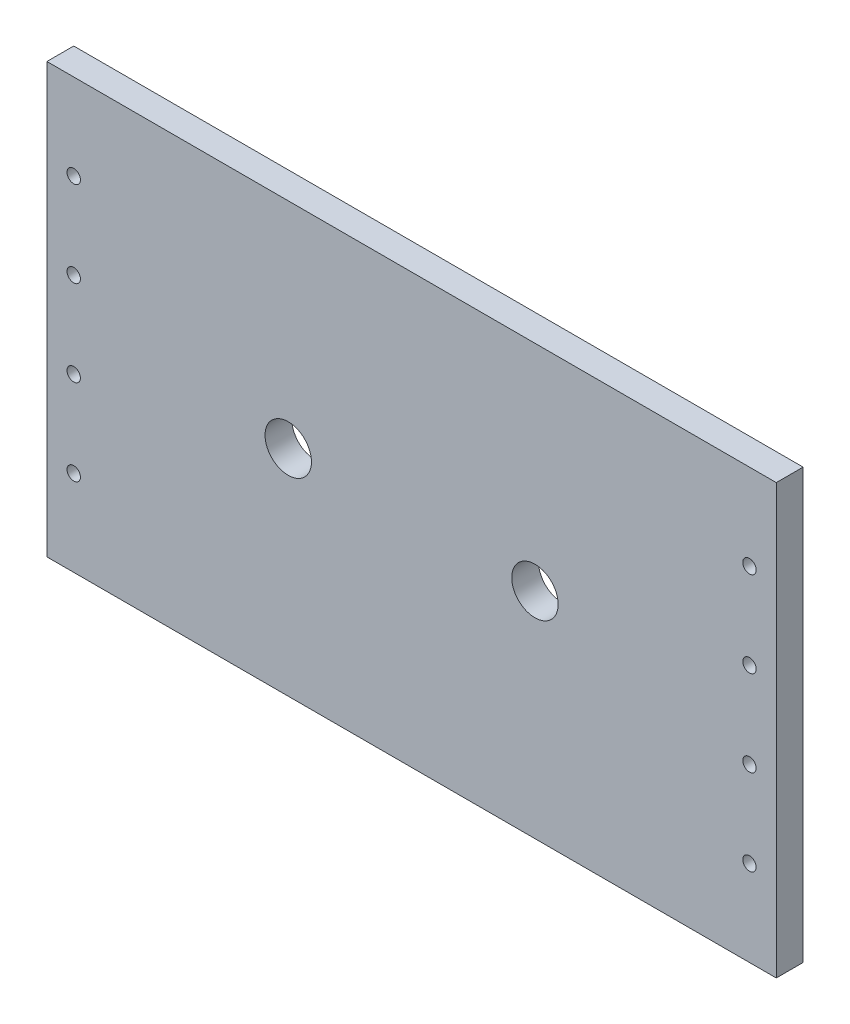
ISO-10303-21;
HEADER;
FILE_DESCRIPTION(('STEP AP214'),'2;1');
FILE_NAME('part.step','',(''),(''),'','','');
FILE_SCHEMA(('AUTOMOTIVE_DESIGN { 1 0 10303 214 1 1 1 1 }'));
ENDSEC;
DATA;
#1=APPLICATION_CONTEXT('core data for automotive mechanical design processes');
#2=APPLICATION_PROTOCOL_DEFINITION('international standard','automotive_design',2000,#1);
#3=PRODUCT_CONTEXT('',#1,'mechanical');
#4=PRODUCT('Part','Part','',(#3));
#5=PRODUCT_RELATED_PRODUCT_CATEGORY('part','',(#4));
#6=PRODUCT_DEFINITION_FORMATION('','',#4);
#7=PRODUCT_DEFINITION_CONTEXT('part definition',#1,'design');
#8=PRODUCT_DEFINITION('design','',#6,#7);
#9=PRODUCT_DEFINITION_SHAPE('','',#8);
#10=(LENGTH_UNIT() NAMED_UNIT(*) SI_UNIT(.MILLI.,.METRE.));
#11=(NAMED_UNIT(*) PLANE_ANGLE_UNIT() SI_UNIT($,.RADIAN.));
#12=(NAMED_UNIT(*) SI_UNIT($,.STERADIAN.) SOLID_ANGLE_UNIT());
#13=UNCERTAINTY_MEASURE_WITH_UNIT(LENGTH_MEASURE(1.E-05),#10,'distance_accuracy_value','');
#14=(GEOMETRIC_REPRESENTATION_CONTEXT(3) GLOBAL_UNCERTAINTY_ASSIGNED_CONTEXT((#13)) GLOBAL_UNIT_ASSIGNED_CONTEXT((#10,
#11,#12)) REPRESENTATION_CONTEXT('',''));
#15=CARTESIAN_POINT('',(0.,0.,0.));
#16=DIRECTION('',(0.,0.,1.));
#17=DIRECTION('',(1.,0.,0.));
#18=AXIS2_PLACEMENT_3D('',#15,#16,#17);
#19=CARTESIAN_POINT('',(0.,0.,6.35));
#20=DIRECTION('',(1.,0.,0.));
#21=DIRECTION('',(0.,0.,-1.));
#22=AXIS2_PLACEMENT_3D('',#19,#20,#21);
#23=PLANE('',#22);
#24=DIRECTION('',(0.,-1.,0.));
#25=VECTOR('',#24,1.);
#26=CARTESIAN_POINT('',(0.,0.,0.));
#27=LINE('',#26,#25);
#28=CARTESIAN_POINT('',(0.,101.6,0.));
#29=VERTEX_POINT('',#28);
#30=CARTESIAN_POINT('',(0.,0.,0.));
#31=VERTEX_POINT('',#30);
#32=EDGE_CURVE('E107',#29,#31,#27,.T.);
#33=ORIENTED_EDGE('',*,*,#32,.T.);
#34=DIRECTION('',(0.,0.,-1.));
#35=VECTOR('',#34,1.);
#36=CARTESIAN_POINT('',(0.,0.,6.35));
#37=LINE('',#36,#35);
#38=CARTESIAN_POINT('',(0.,0.,6.35));
#39=VERTEX_POINT('',#38);
#40=EDGE_CURVE('E11',#39,#31,#37,.T.);
#41=ORIENTED_EDGE('',*,*,#40,.F.);
#42=DIRECTION('',(0.,-1.,0.));
#43=VECTOR('',#42,1.);
#44=CARTESIAN_POINT('',(0.,0.,6.35));
#45=LINE('',#44,#43);
#46=CARTESIAN_POINT('',(0.,101.6,6.35));
#47=VERTEX_POINT('',#46);
#48=EDGE_CURVE('E91',#47,#39,#45,.T.);
#49=ORIENTED_EDGE('',*,*,#48,.F.);
#50=DIRECTION('',(0.,0.,-1.));
#51=VECTOR('',#50,1.);
#52=CARTESIAN_POINT('',(0.,101.6,6.35));
#53=LINE('',#52,#51);
#54=EDGE_CURVE('E103',#47,#29,#53,.T.);
#55=ORIENTED_EDGE('',*,*,#54,.T.);
#56=EDGE_LOOP('',(#33,#41,#49,#55));
#57=FACE_BOUND('',#56,.T.);
#58=ADVANCED_FACE('F39',(#57),#23,.F.);
#59=CARTESIAN_POINT('',(0.,0.,6.35));
#60=DIRECTION('',(0.,1.,0.));
#61=DIRECTION('',(0.,0.,1.));
#62=AXIS2_PLACEMENT_3D('',#59,#60,#61);
#63=PLANE('',#62);
#64=DIRECTION('',(1.,0.,0.));
#65=VECTOR('',#64,1.);
#66=CARTESIAN_POINT('',(0.,0.,0.));
#67=LINE('',#66,#65);
#68=CARTESIAN_POINT('',(172.72,0.,0.));
#69=VERTEX_POINT('',#68);
#70=EDGE_CURVE('E96',#31,#69,#67,.T.);
#71=ORIENTED_EDGE('',*,*,#70,.T.);
#72=DIRECTION('',(0.,0.,-1.));
#73=VECTOR('',#72,1.);
#74=CARTESIAN_POINT('',(172.72,0.,6.35));
#75=LINE('',#74,#73);
#76=CARTESIAN_POINT('',(172.72,0.,6.35));
#77=VERTEX_POINT('',#76);
#78=EDGE_CURVE('E48',#77,#69,#75,.T.);
#79=ORIENTED_EDGE('',*,*,#78,.F.);
#80=DIRECTION('',(1.,0.,0.));
#81=VECTOR('',#80,1.);
#82=CARTESIAN_POINT('',(0.,0.,6.35));
#83=LINE('',#82,#81);
#84=EDGE_CURVE('E86',#39,#77,#83,.T.);
#85=ORIENTED_EDGE('',*,*,#84,.F.);
#86=ORIENTED_EDGE('',*,*,#40,.T.);
#87=EDGE_LOOP('',(#71,#79,#85,#86));
#88=FACE_BOUND('',#87,.T.);
#89=ADVANCED_FACE('F95',(#88),#63,.F.);
#90=CARTESIAN_POINT('',(172.72,0.,6.35));
#91=DIRECTION('',(-1.,0.,0.));
#92=DIRECTION('',(0.,0.,1.));
#93=AXIS2_PLACEMENT_3D('',#90,#91,#92);
#94=PLANE('',#93);
#95=DIRECTION('',(0.,1.,0.));
#96=VECTOR('',#95,1.);
#97=CARTESIAN_POINT('',(172.72,0.,0.));
#98=LINE('',#97,#96);
#99=CARTESIAN_POINT('',(172.72,101.6,0.));
#100=VERTEX_POINT('',#99);
#101=EDGE_CURVE('E73',#69,#100,#98,.T.);
#102=ORIENTED_EDGE('',*,*,#101,.T.);
#103=DIRECTION('',(0.,0.,-1.));
#104=VECTOR('',#103,1.);
#105=CARTESIAN_POINT('',(172.72,101.6,6.35));
#106=LINE('',#105,#104);
#107=CARTESIAN_POINT('',(172.72,101.6,6.35));
#108=VERTEX_POINT('',#107);
#109=EDGE_CURVE('E98',#108,#100,#106,.T.);
#110=ORIENTED_EDGE('',*,*,#109,.F.);
#111=DIRECTION('',(0.,1.,0.));
#112=VECTOR('',#111,1.);
#113=CARTESIAN_POINT('',(172.72,0.,6.35));
#114=LINE('',#113,#112);
#115=EDGE_CURVE('E89',#77,#108,#114,.T.);
#116=ORIENTED_EDGE('',*,*,#115,.F.);
#117=ORIENTED_EDGE('',*,*,#78,.T.);
#118=EDGE_LOOP('',(#102,#110,#116,#117));
#119=FACE_BOUND('',#118,.T.);
#120=ADVANCED_FACE('F99',(#119),#94,.F.);
#121=CARTESIAN_POINT('',(0.,101.6,6.35));
#122=DIRECTION('',(0.,-1.,0.));
#123=DIRECTION('',(0.,0.,-1.));
#124=AXIS2_PLACEMENT_3D('',#121,#122,#123);
#125=PLANE('',#124);
#126=DIRECTION('',(-1.,0.,0.));
#127=VECTOR('',#126,1.);
#128=CARTESIAN_POINT('',(0.,101.6,0.));
#129=LINE('',#128,#127);
#130=EDGE_CURVE('E79',#100,#29,#129,.T.);
#131=ORIENTED_EDGE('',*,*,#130,.T.);
#132=ORIENTED_EDGE('',*,*,#54,.F.);
#133=DIRECTION('',(-1.,0.,0.));
#134=VECTOR('',#133,1.);
#135=CARTESIAN_POINT('',(0.,101.6,6.35));
#136=LINE('',#135,#134);
#137=EDGE_CURVE('E56',#108,#47,#136,.T.);
#138=ORIENTED_EDGE('',*,*,#137,.F.);
#139=ORIENTED_EDGE('',*,*,#109,.T.);
#140=EDGE_LOOP('',(#131,#132,#138,#139));
#141=FACE_BOUND('',#140,.T.);
#142=ADVANCED_FACE('F121',(#141),#125,.F.);
#143=CARTESIAN_POINT('',(0.,0.,6.35));
#144=DIRECTION('',(0.,0.,-1.));
#145=DIRECTION('',(-1.,0.,0.));
#146=AXIS2_PLACEMENT_3D('',#143,#144,#145);
#147=PLANE('',#146);
#148=CARTESIAN_POINT('',(115.57,50.8,6.35));
#149=DIRECTION('',(0.,0.,1.));
#150=DIRECTION('',(1.,0.,0.));
#151=AXIS2_PLACEMENT_3D('',#148,#149,#150);
#152=CIRCLE('',#151,5.49926131403117);
#153=CARTESIAN_POINT('',(121.069261314031,50.8,6.35));
#154=VERTEX_POINT('',#153);
#155=EDGE_CURVE('E200',#154,#154,#152,.T.);
#156=ORIENTED_EDGE('',*,*,#155,.F.);
#157=EDGE_LOOP('',(#156));
#158=FACE_BOUND('',#157,.T.);
#159=CARTESIAN_POINT('',(57.15,50.8,6.35));
#160=DIRECTION('',(0.,0.,1.));
#161=DIRECTION('',(1.,0.,0.));
#162=AXIS2_PLACEMENT_3D('',#159,#160,#161);
#163=CIRCLE('',#162,5.49926131403118);
#164=CARTESIAN_POINT('',(62.6492613140312,50.8,6.35));
#165=VERTEX_POINT('',#164);
#166=EDGE_CURVE('E192',#165,#165,#163,.T.);
#167=ORIENTED_EDGE('',*,*,#166,.F.);
#168=EDGE_LOOP('',(#167));
#169=FACE_BOUND('',#168,.T.);
#170=CARTESIAN_POINT('',(6.34999999999999,60.96,6.35));
#171=DIRECTION('',(0.,0.,1.));
#172=DIRECTION('',(1.,0.,0.));
#173=AXIS2_PLACEMENT_3D('',#170,#171,#172);
#174=CIRCLE('',#173,1.5875);
#175=CARTESIAN_POINT('',(7.9375,60.96,6.35));
#176=VERTEX_POINT('',#175);
#177=EDGE_CURVE('E161',#176,#176,#174,.T.);
#178=ORIENTED_EDGE('',*,*,#177,.F.);
#179=EDGE_LOOP('',(#178));
#180=FACE_BOUND('',#179,.T.);
#181=CARTESIAN_POINT('',(6.34999999999999,40.64,6.35));
#182=DIRECTION('',(0.,0.,1.));
#183=DIRECTION('',(1.,0.,0.));
#184=AXIS2_PLACEMENT_3D('',#181,#182,#183);
#185=CIRCLE('',#184,1.5875);
#186=CARTESIAN_POINT('',(7.93749999999999,40.64,6.35));
#187=VERTEX_POINT('',#186);
#188=EDGE_CURVE('E153',#187,#187,#185,.T.);
#189=ORIENTED_EDGE('',*,*,#188,.F.);
#190=EDGE_LOOP('',(#189));
#191=FACE_BOUND('',#190,.T.);
#192=CARTESIAN_POINT('',(6.34999999999999,20.32,6.35));
#193=DIRECTION('',(0.,0.,1.));
#194=DIRECTION('',(1.,0.,0.));
#195=AXIS2_PLACEMENT_3D('',#192,#193,#194);
#196=CIRCLE('',#195,1.5875);
#197=CARTESIAN_POINT('',(7.93749999999999,20.32,6.35));
#198=VERTEX_POINT('',#197);
#199=EDGE_CURVE('E145',#198,#198,#196,.T.);
#200=ORIENTED_EDGE('',*,*,#199,.F.);
#201=EDGE_LOOP('',(#200));
#202=FACE_BOUND('',#201,.T.);
#203=CARTESIAN_POINT('',(166.37,20.32,6.35));
#204=DIRECTION('',(0.,0.,1.));
#205=DIRECTION('',(1.,0.,0.));
#206=AXIS2_PLACEMENT_3D('',#203,#204,#205);
#207=CIRCLE('',#206,1.58749999999999);
#208=CARTESIAN_POINT('',(167.9575,20.32,6.35));
#209=VERTEX_POINT('',#208);
#210=EDGE_CURVE('E136',#209,#209,#207,.T.);
#211=ORIENTED_EDGE('',*,*,#210,.F.);
#212=EDGE_LOOP('',(#211));
#213=FACE_BOUND('',#212,.T.);
#214=CARTESIAN_POINT('',(166.37,40.64,6.35));
#215=DIRECTION('',(0.,0.,1.));
#216=DIRECTION('',(1.,0.,0.));
#217=AXIS2_PLACEMENT_3D('',#214,#215,#216);
#218=CIRCLE('',#217,1.58749999999999);
#219=CARTESIAN_POINT('',(167.9575,40.64,6.35));
#220=VERTEX_POINT('',#219);
#221=EDGE_CURVE('E185',#220,#220,#218,.T.);
#222=ORIENTED_EDGE('',*,*,#221,.F.);
#223=EDGE_LOOP('',(#222));
#224=FACE_BOUND('',#223,.T.);
#225=CARTESIAN_POINT('',(166.37,60.96,6.35));
#226=DIRECTION('',(0.,0.,1.));
#227=DIRECTION('',(1.,0.,0.));
#228=AXIS2_PLACEMENT_3D('',#225,#226,#227);
#229=CIRCLE('',#228,1.58749999999999);
#230=CARTESIAN_POINT('',(167.9575,60.96,6.35));
#231=VERTEX_POINT('',#230);
#232=EDGE_CURVE('E177',#231,#231,#229,.T.);
#233=ORIENTED_EDGE('',*,*,#232,.F.);
#234=EDGE_LOOP('',(#233));
#235=FACE_BOUND('',#234,.T.);
#236=CARTESIAN_POINT('',(166.37,81.28,6.35));
#237=DIRECTION('',(0.,0.,1.));
#238=DIRECTION('',(1.,0.,0.));
#239=AXIS2_PLACEMENT_3D('',#236,#237,#238);
#240=CIRCLE('',#239,1.58749999999999);
#241=CARTESIAN_POINT('',(167.9575,81.28,6.35));
#242=VERTEX_POINT('',#241);
#243=EDGE_CURVE('E168',#242,#242,#240,.T.);
#244=ORIENTED_EDGE('',*,*,#243,.F.);
#245=EDGE_LOOP('',(#244));
#246=FACE_BOUND('',#245,.T.);
#247=CARTESIAN_POINT('',(6.34999999999999,81.28,6.35));
#248=DIRECTION('',(0.,0.,1.));
#249=DIRECTION('',(1.,0.,0.));
#250=AXIS2_PLACEMENT_3D('',#247,#248,#249);
#251=CIRCLE('',#250,1.5875);
#252=CARTESIAN_POINT('',(7.93749999999999,81.28,6.35));
#253=VERTEX_POINT('',#252);
#254=EDGE_CURVE('E128',#253,#253,#251,.T.);
#255=ORIENTED_EDGE('',*,*,#254,.F.);
#256=EDGE_LOOP('',(#255));
#257=FACE_BOUND('',#256,.T.);
#258=ORIENTED_EDGE('',*,*,#48,.T.);
#259=ORIENTED_EDGE('',*,*,#84,.T.);
#260=ORIENTED_EDGE('',*,*,#115,.T.);
#261=ORIENTED_EDGE('',*,*,#137,.T.);
#262=EDGE_LOOP('',(#258,#259,#260,#261));
#263=FACE_BOUND('',#262,.T.);
#264=ADVANCED_FACE('F87',(#158,#169,#180,#191,#202,#213,#224,#235,#246,#257,#263),#147,.F.);
#265=CARTESIAN_POINT('',(0.,0.,0.));
#266=DIRECTION('',(0.,0.,-1.));
#267=DIRECTION('',(-1.,0.,0.));
#268=AXIS2_PLACEMENT_3D('',#265,#266,#267);
#269=PLANE('',#268);
#270=CARTESIAN_POINT('',(115.57,50.8,0.));
#271=DIRECTION('',(0.,0.,1.));
#272=DIRECTION('',(1.,0.,0.));
#273=AXIS2_PLACEMENT_3D('',#270,#271,#272);
#274=CIRCLE('',#273,5.49926131403117);
#275=CARTESIAN_POINT('',(121.069261314031,50.8,0.));
#276=VERTEX_POINT('',#275);
#277=EDGE_CURVE('E173',#276,#276,#274,.T.);
#278=ORIENTED_EDGE('',*,*,#277,.T.);
#279=EDGE_LOOP('',(#278));
#280=FACE_BOUND('',#279,.T.);
#281=CARTESIAN_POINT('',(57.15,50.8,0.));
#282=DIRECTION('',(0.,0.,1.));
#283=DIRECTION('',(1.,0.,0.));
#284=AXIS2_PLACEMENT_3D('',#281,#282,#283);
#285=CIRCLE('',#284,5.49926131403118);
#286=CARTESIAN_POINT('',(62.6492613140312,50.8,0.));
#287=VERTEX_POINT('',#286);
#288=EDGE_CURVE('E196',#287,#287,#285,.T.);
#289=ORIENTED_EDGE('',*,*,#288,.T.);
#290=EDGE_LOOP('',(#289));
#291=FACE_BOUND('',#290,.T.);
#292=CARTESIAN_POINT('',(6.34999999999999,60.96,0.));
#293=DIRECTION('',(0.,0.,1.));
#294=DIRECTION('',(1.,0.,0.));
#295=AXIS2_PLACEMENT_3D('',#292,#293,#294);
#296=CIRCLE('',#295,1.5875);
#297=CARTESIAN_POINT('',(7.9375,60.96,0.));
#298=VERTEX_POINT('',#297);
#299=EDGE_CURVE('E132',#298,#298,#296,.T.);
#300=ORIENTED_EDGE('',*,*,#299,.T.);
#301=EDGE_LOOP('',(#300));
#302=FACE_BOUND('',#301,.T.);
#303=CARTESIAN_POINT('',(6.34999999999999,40.64,0.));
#304=DIRECTION('',(0.,0.,1.));
#305=DIRECTION('',(1.,0.,0.));
#306=AXIS2_PLACEMENT_3D('',#303,#304,#305);
#307=CIRCLE('',#306,1.5875);
#308=CARTESIAN_POINT('',(7.93749999999999,40.64,0.));
#309=VERTEX_POINT('',#308);
#310=EDGE_CURVE('E157',#309,#309,#307,.T.);
#311=ORIENTED_EDGE('',*,*,#310,.T.);
#312=EDGE_LOOP('',(#311));
#313=FACE_BOUND('',#312,.T.);
#314=CARTESIAN_POINT('',(6.34999999999999,20.32,0.));
#315=DIRECTION('',(0.,0.,1.));
#316=DIRECTION('',(1.,0.,0.));
#317=AXIS2_PLACEMENT_3D('',#314,#315,#316);
#318=CIRCLE('',#317,1.5875);
#319=CARTESIAN_POINT('',(7.93749999999999,20.32,0.));
#320=VERTEX_POINT('',#319);
#321=EDGE_CURVE('E149',#320,#320,#318,.T.);
#322=ORIENTED_EDGE('',*,*,#321,.T.);
#323=EDGE_LOOP('',(#322));
#324=FACE_BOUND('',#323,.T.);
#325=CARTESIAN_POINT('',(166.37,20.32,0.));
#326=DIRECTION('',(0.,0.,1.));
#327=DIRECTION('',(1.,0.,0.));
#328=AXIS2_PLACEMENT_3D('',#325,#326,#327);
#329=CIRCLE('',#328,1.58749999999999);
#330=CARTESIAN_POINT('',(167.9575,20.32,0.));
#331=VERTEX_POINT('',#330);
#332=EDGE_CURVE('E140',#331,#331,#329,.T.);
#333=ORIENTED_EDGE('',*,*,#332,.T.);
#334=EDGE_LOOP('',(#333));
#335=FACE_BOUND('',#334,.T.);
#336=CARTESIAN_POINT('',(166.37,40.64,0.));
#337=DIRECTION('',(0.,0.,1.));
#338=DIRECTION('',(1.,0.,0.));
#339=AXIS2_PLACEMENT_3D('',#336,#337,#338);
#340=CIRCLE('',#339,1.58749999999999);
#341=CARTESIAN_POINT('',(167.9575,40.64,0.));
#342=VERTEX_POINT('',#341);
#343=EDGE_CURVE('E141',#342,#342,#340,.T.);
#344=ORIENTED_EDGE('',*,*,#343,.T.);
#345=EDGE_LOOP('',(#344));
#346=FACE_BOUND('',#345,.T.);
#347=CARTESIAN_POINT('',(166.37,60.96,0.));
#348=DIRECTION('',(0.,0.,1.));
#349=DIRECTION('',(1.,0.,0.));
#350=AXIS2_PLACEMENT_3D('',#347,#348,#349);
#351=CIRCLE('',#350,1.58749999999999);
#352=CARTESIAN_POINT('',(167.9575,60.96,0.));
#353=VERTEX_POINT('',#352);
#354=EDGE_CURVE('E181',#353,#353,#351,.T.);
#355=ORIENTED_EDGE('',*,*,#354,.T.);
#356=EDGE_LOOP('',(#355));
#357=FACE_BOUND('',#356,.T.);
#358=CARTESIAN_POINT('',(166.37,81.28,0.));
#359=DIRECTION('',(0.,0.,1.));
#360=DIRECTION('',(1.,0.,0.));
#361=AXIS2_PLACEMENT_3D('',#358,#359,#360);
#362=CIRCLE('',#361,1.58749999999999);
#363=CARTESIAN_POINT('',(167.9575,81.28,0.));
#364=VERTEX_POINT('',#363);
#365=EDGE_CURVE('E172',#364,#364,#362,.T.);
#366=ORIENTED_EDGE('',*,*,#365,.T.);
#367=EDGE_LOOP('',(#366));
#368=FACE_BOUND('',#367,.T.);
#369=CARTESIAN_POINT('',(6.34999999999999,81.28,0.));
#370=DIRECTION('',(0.,0.,1.));
#371=DIRECTION('',(1.,0.,0.));
#372=AXIS2_PLACEMENT_3D('',#369,#370,#371);
#373=CIRCLE('',#372,1.5875);
#374=CARTESIAN_POINT('',(7.93749999999999,81.28,0.));
#375=VERTEX_POINT('',#374);
#376=EDGE_CURVE('E111',#375,#375,#373,.T.);
#377=ORIENTED_EDGE('',*,*,#376,.T.);
#378=EDGE_LOOP('',(#377));
#379=FACE_BOUND('',#378,.T.);
#380=ORIENTED_EDGE('',*,*,#32,.F.);
#381=ORIENTED_EDGE('',*,*,#130,.F.);
#382=ORIENTED_EDGE('',*,*,#101,.F.);
#383=ORIENTED_EDGE('',*,*,#70,.F.);
#384=EDGE_LOOP('',(#380,#381,#382,#383));
#385=FACE_BOUND('',#384,.T.);
#386=ADVANCED_FACE('F124',(#280,#291,#302,#313,#324,#335,#346,#357,#368,#379,#385),#269,.T.);
#387=CARTESIAN_POINT('',(6.34999999999999,81.28,0.));
#388=DIRECTION('',(0.,0.,1.));
#389=DIRECTION('',(1.,0.,0.));
#390=AXIS2_PLACEMENT_3D('',#387,#388,#389);
#391=CYLINDRICAL_SURFACE('',#390,1.5875);
#392=ORIENTED_EDGE('',*,*,#376,.F.);
#393=EDGE_LOOP('',(#392));
#394=FACE_BOUND('',#393,.T.);
#395=ORIENTED_EDGE('',*,*,#254,.T.);
#396=EDGE_LOOP('',(#395));
#397=FACE_BOUND('',#396,.T.);
#398=ADVANCED_FACE('F238',(#394,#397),#391,.F.);
#399=CARTESIAN_POINT('',(166.37,81.28,0.));
#400=DIRECTION('',(0.,0.,1.));
#401=DIRECTION('',(1.,0.,0.));
#402=AXIS2_PLACEMENT_3D('',#399,#400,#401);
#403=CYLINDRICAL_SURFACE('',#402,1.58749999999999);
#404=ORIENTED_EDGE('',*,*,#365,.F.);
#405=EDGE_LOOP('',(#404));
#406=FACE_BOUND('',#405,.T.);
#407=ORIENTED_EDGE('',*,*,#243,.T.);
#408=EDGE_LOOP('',(#407));
#409=FACE_BOUND('',#408,.T.);
#410=ADVANCED_FACE('F240',(#406,#409),#403,.F.);
#411=CARTESIAN_POINT('',(166.37,60.96,0.));
#412=DIRECTION('',(0.,0.,1.));
#413=DIRECTION('',(1.,0.,0.));
#414=AXIS2_PLACEMENT_3D('',#411,#412,#413);
#415=CYLINDRICAL_SURFACE('',#414,1.58749999999999);
#416=ORIENTED_EDGE('',*,*,#354,.F.);
#417=EDGE_LOOP('',(#416));
#418=FACE_BOUND('',#417,.T.);
#419=ORIENTED_EDGE('',*,*,#232,.T.);
#420=EDGE_LOOP('',(#419));
#421=FACE_BOUND('',#420,.T.);
#422=ADVANCED_FACE('F247',(#418,#421),#415,.F.);
#423=CARTESIAN_POINT('',(166.37,40.64,0.));
#424=DIRECTION('',(0.,0.,1.));
#425=DIRECTION('',(1.,0.,0.));
#426=AXIS2_PLACEMENT_3D('',#423,#424,#425);
#427=CYLINDRICAL_SURFACE('',#426,1.58749999999999);
#428=ORIENTED_EDGE('',*,*,#343,.F.);
#429=EDGE_LOOP('',(#428));
#430=FACE_BOUND('',#429,.T.);
#431=ORIENTED_EDGE('',*,*,#221,.T.);
#432=EDGE_LOOP('',(#431));
#433=FACE_BOUND('',#432,.T.);
#434=ADVANCED_FACE('F324',(#430,#433),#427,.F.);
#435=CARTESIAN_POINT('',(166.37,20.32,0.));
#436=DIRECTION('',(0.,0.,1.));
#437=DIRECTION('',(1.,0.,0.));
#438=AXIS2_PLACEMENT_3D('',#435,#436,#437);
#439=CYLINDRICAL_SURFACE('',#438,1.58749999999999);
#440=ORIENTED_EDGE('',*,*,#332,.F.);
#441=EDGE_LOOP('',(#440));
#442=FACE_BOUND('',#441,.T.);
#443=ORIENTED_EDGE('',*,*,#210,.T.);
#444=EDGE_LOOP('',(#443));
#445=FACE_BOUND('',#444,.T.);
#446=ADVANCED_FACE('F316',(#442,#445),#439,.F.);
#447=CARTESIAN_POINT('',(6.34999999999999,20.32,0.));
#448=DIRECTION('',(0.,0.,1.));
#449=DIRECTION('',(1.,0.,0.));
#450=AXIS2_PLACEMENT_3D('',#447,#448,#449);
#451=CYLINDRICAL_SURFACE('',#450,1.5875);
#452=ORIENTED_EDGE('',*,*,#321,.F.);
#453=EDGE_LOOP('',(#452));
#454=FACE_BOUND('',#453,.T.);
#455=ORIENTED_EDGE('',*,*,#199,.T.);
#456=EDGE_LOOP('',(#455));
#457=FACE_BOUND('',#456,.T.);
#458=ADVANCED_FACE('F308',(#454,#457),#451,.F.);
#459=CARTESIAN_POINT('',(6.34999999999999,40.64,0.));
#460=DIRECTION('',(0.,0.,1.));
#461=DIRECTION('',(1.,0.,0.));
#462=AXIS2_PLACEMENT_3D('',#459,#460,#461);
#463=CYLINDRICAL_SURFACE('',#462,1.5875);
#464=ORIENTED_EDGE('',*,*,#310,.F.);
#465=EDGE_LOOP('',(#464));
#466=FACE_BOUND('',#465,.T.);
#467=ORIENTED_EDGE('',*,*,#188,.T.);
#468=EDGE_LOOP('',(#467));
#469=FACE_BOUND('',#468,.T.);
#470=ADVANCED_FACE('F301',(#466,#469),#463,.F.);
#471=CARTESIAN_POINT('',(6.34999999999999,60.96,0.));
#472=DIRECTION('',(0.,0.,1.));
#473=DIRECTION('',(1.,0.,0.));
#474=AXIS2_PLACEMENT_3D('',#471,#472,#473);
#475=CYLINDRICAL_SURFACE('',#474,1.5875);
#476=ORIENTED_EDGE('',*,*,#299,.F.);
#477=EDGE_LOOP('',(#476));
#478=FACE_BOUND('',#477,.T.);
#479=ORIENTED_EDGE('',*,*,#177,.T.);
#480=EDGE_LOOP('',(#479));
#481=FACE_BOUND('',#480,.T.);
#482=ADVANCED_FACE('F286',(#478,#481),#475,.F.);
#483=CARTESIAN_POINT('',(57.15,50.8,0.));
#484=DIRECTION('',(0.,0.,1.));
#485=DIRECTION('',(1.,0.,0.));
#486=AXIS2_PLACEMENT_3D('',#483,#484,#485);
#487=CYLINDRICAL_SURFACE('',#486,5.49926131403118);
#488=ORIENTED_EDGE('',*,*,#288,.F.);
#489=EDGE_LOOP('',(#488));
#490=FACE_BOUND('',#489,.T.);
#491=ORIENTED_EDGE('',*,*,#166,.T.);
#492=EDGE_LOOP('',(#491));
#493=FACE_BOUND('',#492,.T.);
#494=ADVANCED_FACE('F213',(#490,#493),#487,.F.);
#495=CARTESIAN_POINT('',(115.57,50.8,0.));
#496=DIRECTION('',(0.,0.,1.));
#497=DIRECTION('',(1.,0.,0.));
#498=AXIS2_PLACEMENT_3D('',#495,#496,#497);
#499=CYLINDRICAL_SURFACE('',#498,5.49926131403117);
#500=ORIENTED_EDGE('',*,*,#277,.F.);
#501=EDGE_LOOP('',(#500));
#502=FACE_BOUND('',#501,.T.);
#503=ORIENTED_EDGE('',*,*,#155,.T.);
#504=EDGE_LOOP('',(#503));
#505=FACE_BOUND('',#504,.T.);
#506=ADVANCED_FACE('F210',(#502,#505),#499,.F.);
#507=CLOSED_SHELL('',(#58,#89,#120,#142,#264,#386,#398,#410,#422,#434,#446,#458,#470,#482,#494,#506));
#508=MANIFOLD_SOLID_BREP('B2',#507);
#509=ADVANCED_BREP_SHAPE_REPRESENTATION('',(#18,#508),#14);
#510=SHAPE_DEFINITION_REPRESENTATION(#9,#509);
ENDSEC;
END-ISO-10303-21;
